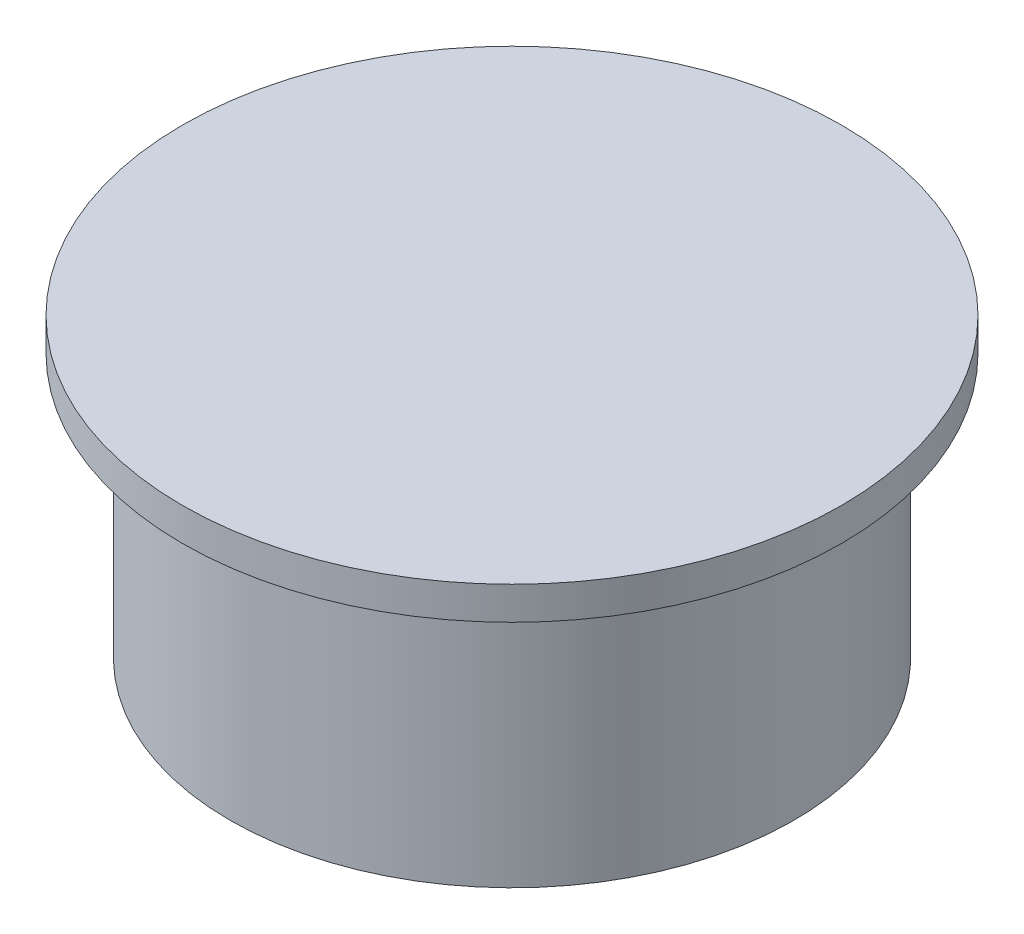
ISO-10303-21;
HEADER;
FILE_DESCRIPTION(('STEP AP214'),'2;1');
FILE_NAME('part.step','',(''),(''),'','','');
FILE_SCHEMA(('AUTOMOTIVE_DESIGN { 1 0 10303 214 1 1 1 1 }'));
ENDSEC;
DATA;
#1=APPLICATION_CONTEXT('core data for automotive mechanical design processes');
#2=APPLICATION_PROTOCOL_DEFINITION('international standard','automotive_design',2000,#1);
#3=PRODUCT_CONTEXT('',#1,'mechanical');
#4=PRODUCT('Part','Part','',(#3));
#5=PRODUCT_RELATED_PRODUCT_CATEGORY('part','',(#4));
#6=PRODUCT_DEFINITION_FORMATION('','',#4);
#7=PRODUCT_DEFINITION_CONTEXT('part definition',#1,'design');
#8=PRODUCT_DEFINITION('design','',#6,#7);
#9=PRODUCT_DEFINITION_SHAPE('','',#8);
#10=(LENGTH_UNIT() NAMED_UNIT(*) SI_UNIT(.MILLI.,.METRE.));
#11=(NAMED_UNIT(*) PLANE_ANGLE_UNIT() SI_UNIT($,.RADIAN.));
#12=(NAMED_UNIT(*) SI_UNIT($,.STERADIAN.) SOLID_ANGLE_UNIT());
#13=UNCERTAINTY_MEASURE_WITH_UNIT(LENGTH_MEASURE(1.E-05),#10,'distance_accuracy_value','');
#14=(GEOMETRIC_REPRESENTATION_CONTEXT(3) GLOBAL_UNCERTAINTY_ASSIGNED_CONTEXT((#13)) GLOBAL_UNIT_ASSIGNED_CONTEXT((#10,
#11,#12)) REPRESENTATION_CONTEXT('',''));
#15=CARTESIAN_POINT('',(0.,0.,0.));
#16=DIRECTION('',(0.,0.,1.));
#17=DIRECTION('',(1.,0.,0.));
#18=AXIS2_PLACEMENT_3D('',#15,#16,#17);
#19=CARTESIAN_POINT('',(0.,-10.,0.));
#20=DIRECTION('',(0.,1.,0.));
#21=DIRECTION('',(0.,0.,1.));
#22=AXIS2_PLACEMENT_3D('',#19,#20,#21);
#23=PLANE('',#22);
#24=CARTESIAN_POINT('',(0.,-10.,0.));
#25=DIRECTION('',(0.,1.,0.));
#26=DIRECTION('',(0.,0.,1.));
#27=AXIS2_PLACEMENT_3D('',#24,#25,#26);
#28=CIRCLE('',#27,21.3847763108502);
#29=CARTESIAN_POINT('',(0.,-10.,21.3847763108502));
#30=VERTEX_POINT('',#29);
#31=EDGE_CURVE('E99',#30,#30,#28,.T.);
#32=ORIENTED_EDGE('',*,*,#31,.F.);
#33=EDGE_LOOP('',(#32));
#34=FACE_BOUND('',#33,.T.);
#35=DIRECTION('',(0.,0.,1.));
#36=VECTOR('',#35,1.);
#37=CARTESIAN_POINT('',(-13.,-10.,-13.));
#38=LINE('',#37,#36);
#39=CARTESIAN_POINT('',(-13.,-10.,-13.));
#40=VERTEX_POINT('',#39);
#41=CARTESIAN_POINT('',(-13.,-10.,13.));
#42=VERTEX_POINT('',#41);
#43=EDGE_CURVE('E59',#40,#42,#38,.T.);
#44=ORIENTED_EDGE('',*,*,#43,.T.);
#45=DIRECTION('',(1.,0.,0.));
#46=VECTOR('',#45,1.);
#47=CARTESIAN_POINT('',(-13.,-10.,13.));
#48=LINE('',#47,#46);
#49=CARTESIAN_POINT('',(13.,-10.,13.));
#50=VERTEX_POINT('',#49);
#51=EDGE_CURVE('E247',#42,#50,#48,.T.);
#52=ORIENTED_EDGE('',*,*,#51,.T.);
#53=DIRECTION('',(0.,0.,-1.));
#54=VECTOR('',#53,1.);
#55=CARTESIAN_POINT('',(13.,-10.,-13.));
#56=LINE('',#55,#54);
#57=CARTESIAN_POINT('',(13.,-10.,-13.));
#58=VERTEX_POINT('',#57);
#59=EDGE_CURVE('E95',#50,#58,#56,.T.);
#60=ORIENTED_EDGE('',*,*,#59,.T.);
#61=DIRECTION('',(-1.,0.,0.));
#62=VECTOR('',#61,1.);
#63=CARTESIAN_POINT('',(-13.,-10.,-13.));
#64=LINE('',#63,#62);
#65=EDGE_CURVE('E243',#58,#40,#64,.T.);
#66=ORIENTED_EDGE('',*,*,#65,.T.);
#67=EDGE_LOOP('',(#44,#52,#60,#66));
#68=FACE_BOUND('',#67,.T.);
#69=ADVANCED_FACE('F36',(#34,#68),#23,.F.);
#70=CARTESIAN_POINT('',(0.,10.,0.));
#71=DIRECTION('',(0.,-1.,0.));
#72=DIRECTION('',(0.,0.,-1.));
#73=AXIS2_PLACEMENT_3D('',#70,#71,#72);
#74=CYLINDRICAL_SURFACE('',#73,21.3847763108502);
#75=CARTESIAN_POINT('',(0.,8.,0.));
#76=DIRECTION('',(0.,1.,0.));
#77=DIRECTION('',(0.,0.,1.));
#78=AXIS2_PLACEMENT_3D('',#75,#76,#77);
#79=CIRCLE('',#78,21.3847763108502);
#80=CARTESIAN_POINT('',(0.,8.,21.3847763108502));
#81=VERTEX_POINT('',#80);
#82=EDGE_CURVE('E11',#81,#81,#79,.F.);
#83=ORIENTED_EDGE('',*,*,#82,.T.);
#84=EDGE_LOOP('',(#83));
#85=FACE_BOUND('',#84,.T.);
#86=ORIENTED_EDGE('',*,*,#31,.T.);
#87=EDGE_LOOP('',(#86));
#88=FACE_BOUND('',#87,.T.);
#89=ADVANCED_FACE('F123',(#85,#88),#74,.T.);
#90=CARTESIAN_POINT('',(-13.,10.,-13.));
#91=DIRECTION('',(1.,0.,0.));
#92=DIRECTION('',(0.,0.,-1.));
#93=AXIS2_PLACEMENT_3D('',#90,#91,#92);
#94=PLANE('',#93);
#95=ORIENTED_EDGE('',*,*,#43,.F.);
#96=DIRECTION('',(0.,-1.,0.));
#97=VECTOR('',#96,1.);
#98=CARTESIAN_POINT('',(-13.,10.,-13.));
#99=LINE('',#98,#97);
#100=CARTESIAN_POINT('',(-13.,10.,-13.));
#101=VERTEX_POINT('',#100);
#102=EDGE_CURVE('E101',#101,#40,#99,.T.);
#103=ORIENTED_EDGE('',*,*,#102,.F.);
#104=DIRECTION('',(0.,0.,1.));
#105=VECTOR('',#104,1.);
#106=CARTESIAN_POINT('',(-13.,10.,-13.));
#107=LINE('',#106,#105);
#108=CARTESIAN_POINT('',(-13.,10.,13.));
#109=VERTEX_POINT('',#108);
#110=EDGE_CURVE('E91',#101,#109,#107,.T.);
#111=ORIENTED_EDGE('',*,*,#110,.T.);
#112=DIRECTION('',(0.,-1.,0.));
#113=VECTOR('',#112,1.);
#114=CARTESIAN_POINT('',(-13.,10.,13.));
#115=LINE('',#114,#113);
#116=EDGE_CURVE('E90',#109,#42,#115,.T.);
#117=ORIENTED_EDGE('',*,*,#116,.T.);
#118=EDGE_LOOP('',(#95,#103,#111,#117));
#119=FACE_BOUND('',#118,.T.);
#120=ADVANCED_FACE('F129',(#119),#94,.T.);
#121=CARTESIAN_POINT('',(-13.,10.,13.));
#122=DIRECTION('',(0.,0.,-1.));
#123=DIRECTION('',(-1.,0.,0.));
#124=AXIS2_PLACEMENT_3D('',#121,#122,#123);
#125=PLANE('',#124);
#126=ORIENTED_EDGE('',*,*,#51,.F.);
#127=ORIENTED_EDGE('',*,*,#116,.F.);
#128=DIRECTION('',(1.,0.,0.));
#129=VECTOR('',#128,1.);
#130=CARTESIAN_POINT('',(-13.,10.,13.));
#131=LINE('',#130,#129);
#132=CARTESIAN_POINT('',(13.,10.,13.));
#133=VERTEX_POINT('',#132);
#134=EDGE_CURVE('E80',#109,#133,#131,.T.);
#135=ORIENTED_EDGE('',*,*,#134,.T.);
#136=DIRECTION('',(0.,-1.,0.));
#137=VECTOR('',#136,1.);
#138=CARTESIAN_POINT('',(13.,10.,13.));
#139=LINE('',#138,#137);
#140=EDGE_CURVE('E88',#133,#50,#139,.T.);
#141=ORIENTED_EDGE('',*,*,#140,.T.);
#142=EDGE_LOOP('',(#126,#127,#135,#141));
#143=FACE_BOUND('',#142,.T.);
#144=ADVANCED_FACE('F87',(#143),#125,.T.);
#145=CARTESIAN_POINT('',(13.,10.,-13.));
#146=DIRECTION('',(-1.,0.,0.));
#147=DIRECTION('',(0.,0.,1.));
#148=AXIS2_PLACEMENT_3D('',#145,#146,#147);
#149=PLANE('',#148);
#150=ORIENTED_EDGE('',*,*,#59,.F.);
#151=ORIENTED_EDGE('',*,*,#140,.F.);
#152=DIRECTION('',(0.,0.,-1.));
#153=VECTOR('',#152,1.);
#154=CARTESIAN_POINT('',(13.,10.,-13.));
#155=LINE('',#154,#153);
#156=CARTESIAN_POINT('',(13.,10.,-13.));
#157=VERTEX_POINT('',#156);
#158=EDGE_CURVE('E77',#133,#157,#155,.T.);
#159=ORIENTED_EDGE('',*,*,#158,.T.);
#160=DIRECTION('',(0.,-1.,0.));
#161=VECTOR('',#160,1.);
#162=CARTESIAN_POINT('',(13.,10.,-13.));
#163=LINE('',#162,#161);
#164=EDGE_CURVE('E97',#157,#58,#163,.T.);
#165=ORIENTED_EDGE('',*,*,#164,.T.);
#166=EDGE_LOOP('',(#150,#151,#159,#165));
#167=FACE_BOUND('',#166,.T.);
#168=ADVANCED_FACE('F93',(#167),#149,.T.);
#169=CARTESIAN_POINT('',(-13.,10.,-13.));
#170=DIRECTION('',(0.,0.,1.));
#171=DIRECTION('',(1.,0.,0.));
#172=AXIS2_PLACEMENT_3D('',#169,#170,#171);
#173=PLANE('',#172);
#174=ORIENTED_EDGE('',*,*,#65,.F.);
#175=ORIENTED_EDGE('',*,*,#164,.F.);
#176=DIRECTION('',(-1.,0.,0.));
#177=VECTOR('',#176,1.);
#178=CARTESIAN_POINT('',(-13.,10.,-13.));
#179=LINE('',#178,#177);
#180=EDGE_CURVE('E51',#157,#101,#179,.T.);
#181=ORIENTED_EDGE('',*,*,#180,.T.);
#182=ORIENTED_EDGE('',*,*,#102,.T.);
#183=EDGE_LOOP('',(#174,#175,#181,#182));
#184=FACE_BOUND('',#183,.T.);
#185=ADVANCED_FACE('F140',(#184),#173,.T.);
#186=CARTESIAN_POINT('',(0.,10.,0.));
#187=DIRECTION('',(0.,1.,0.));
#188=DIRECTION('',(0.,0.,1.));
#189=AXIS2_PLACEMENT_3D('',#186,#187,#188);
#190=PLANE('',#189);
#191=ORIENTED_EDGE('',*,*,#134,.F.);
#192=ORIENTED_EDGE('',*,*,#110,.F.);
#193=ORIENTED_EDGE('',*,*,#180,.F.);
#194=ORIENTED_EDGE('',*,*,#158,.F.);
#195=EDGE_LOOP('',(#191,#192,#193,#194));
#196=FACE_BOUND('',#195,.T.);
#197=ADVANCED_FACE('F79',(#196),#190,.F.);
#198=CARTESIAN_POINT('',(0.,10.,0.));
#199=DIRECTION('',(0.,1.,0.));
#200=DIRECTION('',(0.,0.,1.));
#201=AXIS2_PLACEMENT_3D('',#198,#199,#200);
#202=CIRCLE('',#201,23.3847763108502);
#203=CARTESIAN_POINT('',(0.,10.,23.3847763108502));
#204=VERTEX_POINT('',#203);
#205=EDGE_CURVE('E44',#204,#204,#202,.T.);
#206=ORIENTED_EDGE('',*,*,#205,.T.);
#207=EDGE_LOOP('',(#206));
#208=FACE_BOUND('',#207,.T.);
#209=CARTESIAN_POINT('',(0.,10.,0.));
#210=DIRECTION('',(0.,1.,0.));
#211=DIRECTION('',(0.,0.,1.));
#212=AXIS2_PLACEMENT_3D('',#209,#210,#211);
#213=CIRCLE('',#212,25.);
#214=CARTESIAN_POINT('',(0.,10.,25.));
#215=VERTEX_POINT('',#214);
#216=EDGE_CURVE('E239',#215,#215,#213,.T.);
#217=ORIENTED_EDGE('',*,*,#216,.F.);
#218=EDGE_LOOP('',(#217));
#219=FACE_BOUND('',#218,.T.);
#220=ADVANCED_FACE('F109',(#208,#219),#190,.F.);
#221=CARTESIAN_POINT('',(0.,12.5,0.));
#222=DIRECTION('',(0.,-1.,0.));
#223=DIRECTION('',(0.,0.,-1.));
#224=AXIS2_PLACEMENT_3D('',#221,#222,#223);
#225=CYLINDRICAL_SURFACE('',#224,25.);
#226=CARTESIAN_POINT('',(0.,12.5,0.));
#227=DIRECTION('',(0.,1.,0.));
#228=DIRECTION('',(0.,0.,1.));
#229=AXIS2_PLACEMENT_3D('',#226,#227,#228);
#230=CIRCLE('',#229,25.);
#231=CARTESIAN_POINT('',(0.,12.5,25.));
#232=VERTEX_POINT('',#231);
#233=EDGE_CURVE('E236',#232,#232,#230,.T.);
#234=ORIENTED_EDGE('',*,*,#233,.F.);
#235=EDGE_LOOP('',(#234));
#236=FACE_BOUND('',#235,.T.);
#237=ORIENTED_EDGE('',*,*,#216,.T.);
#238=EDGE_LOOP('',(#237));
#239=FACE_BOUND('',#238,.T.);
#240=ADVANCED_FACE('F118',(#236,#239),#225,.T.);
#241=CARTESIAN_POINT('',(0.,12.5,0.));
#242=DIRECTION('',(0.,1.,0.));
#243=DIRECTION('',(0.,0.,1.));
#244=AXIS2_PLACEMENT_3D('',#241,#242,#243);
#245=PLANE('',#244);
#246=ORIENTED_EDGE('',*,*,#233,.T.);
#247=EDGE_LOOP('',(#246));
#248=FACE_BOUND('',#247,.T.);
#249=ADVANCED_FACE('F113',(#248),#245,.T.);
#250=CARTESIAN_POINT('',(0.,8.,0.));
#251=DIRECTION('',(0.,1.,0.));
#252=DIRECTION('',(0.,0.,1.));
#253=AXIS2_PLACEMENT_3D('',#250,#251,#252);
#254=TOROIDAL_SURFACE('',#253,23.3847763108502,2.);
#255=ORIENTED_EDGE('',*,*,#82,.F.);
#256=EDGE_LOOP('',(#255));
#257=FACE_BOUND('',#256,.T.);
#258=ORIENTED_EDGE('',*,*,#205,.F.);
#259=EDGE_LOOP('',(#258));
#260=FACE_BOUND('',#259,.T.);
#261=ADVANCED_FACE('F38',(#257,#260),#254,.F.);
#262=CLOSED_SHELL('',(#69,#89,#120,#144,#168,#185,#197,#220,#240,#249,#261));
#263=MANIFOLD_SOLID_BREP('B2',#262);
#264=ADVANCED_BREP_SHAPE_REPRESENTATION('',(#18,#263),#14);
#265=SHAPE_DEFINITION_REPRESENTATION(#9,#264);
ENDSEC;
END-ISO-10303-21;
